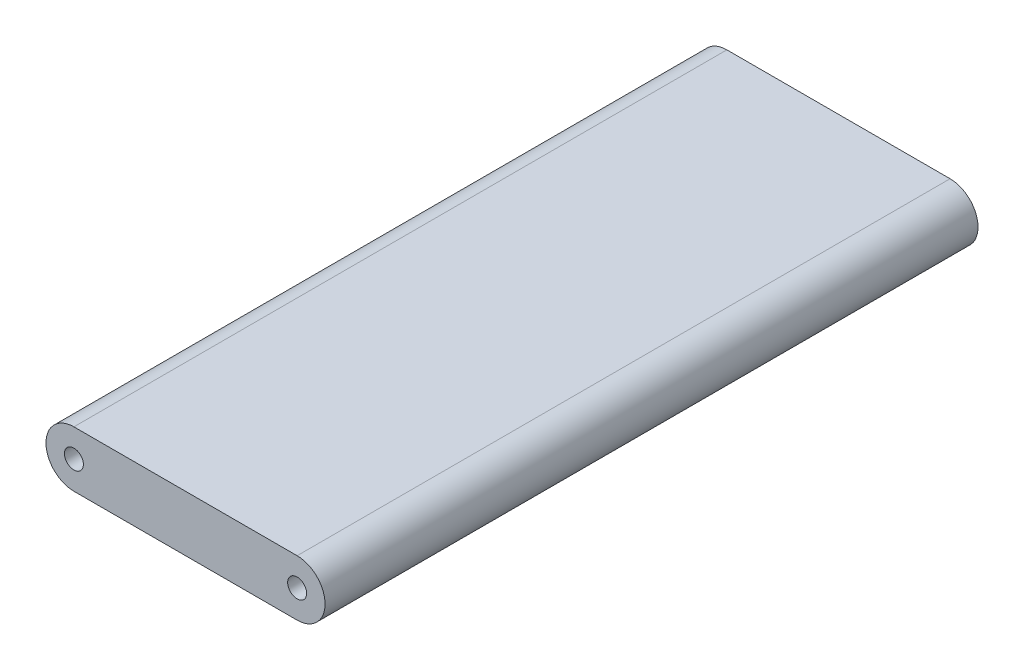
ISO-10303-21;
HEADER;
FILE_DESCRIPTION(('STEP AP214'),'2;1');
FILE_NAME('part.step','',(''),(''),'','','');
FILE_SCHEMA(('AUTOMOTIVE_DESIGN { 1 0 10303 214 1 1 1 1 }'));
ENDSEC;
DATA;
#1=APPLICATION_CONTEXT('core data for automotive mechanical design processes');
#2=APPLICATION_PROTOCOL_DEFINITION('international standard','automotive_design',2000,#1);
#3=PRODUCT_CONTEXT('',#1,'mechanical');
#4=PRODUCT('Part','Part','',(#3));
#5=PRODUCT_RELATED_PRODUCT_CATEGORY('part','',(#4));
#6=PRODUCT_DEFINITION_FORMATION('','',#4);
#7=PRODUCT_DEFINITION_CONTEXT('part definition',#1,'design');
#8=PRODUCT_DEFINITION('design','',#6,#7);
#9=PRODUCT_DEFINITION_SHAPE('','',#8);
#10=(LENGTH_UNIT() NAMED_UNIT(*) SI_UNIT(.MILLI.,.METRE.));
#11=(NAMED_UNIT(*) PLANE_ANGLE_UNIT() SI_UNIT($,.RADIAN.));
#12=(NAMED_UNIT(*) SI_UNIT($,.STERADIAN.) SOLID_ANGLE_UNIT());
#13=UNCERTAINTY_MEASURE_WITH_UNIT(LENGTH_MEASURE(1.E-05),#10,'distance_accuracy_value','');
#14=(GEOMETRIC_REPRESENTATION_CONTEXT(3) GLOBAL_UNCERTAINTY_ASSIGNED_CONTEXT((#13)) GLOBAL_UNIT_ASSIGNED_CONTEXT((#10,
#11,#12)) REPRESENTATION_CONTEXT('',''));
#15=CARTESIAN_POINT('',(0.,0.,0.));
#16=DIRECTION('',(0.,0.,1.));
#17=DIRECTION('',(1.,0.,0.));
#18=AXIS2_PLACEMENT_3D('',#15,#16,#17);
#19=CARTESIAN_POINT('',(0.,0.,58.5));
#20=DIRECTION('',(0.,0.,1.));
#21=DIRECTION('',(1.,0.,0.));
#22=AXIS2_PLACEMENT_3D('',#19,#20,#21);
#23=PLANE('',#22);
#24=CARTESIAN_POINT('',(0.,0.,58.5));
#25=DIRECTION('',(0.,0.,1.));
#26=DIRECTION('',(1.,0.,0.));
#27=AXIS2_PLACEMENT_3D('',#24,#25,#26);
#28=CIRCLE('',#27,0.85);
#29=CARTESIAN_POINT('',(0.85,0.,58.5));
#30=VERTEX_POINT('',#29);
#31=EDGE_CURVE('E100',#30,#30,#28,.T.);
#32=ORIENTED_EDGE('',*,*,#31,.F.);
#33=EDGE_LOOP('',(#32));
#34=FACE_BOUND('',#33,.T.);
#35=CARTESIAN_POINT('',(0.,0.,58.5));
#36=DIRECTION('',(0.,0.,1.));
#37=DIRECTION('',(1.,0.,0.));
#38=AXIS2_PLACEMENT_3D('',#35,#36,#37);
#39=CIRCLE('',#38,2.5);
#40=CARTESIAN_POINT('',(0.,2.5,58.5));
#41=VERTEX_POINT('',#40);
#42=CARTESIAN_POINT('',(0.,-2.5,58.5));
#43=VERTEX_POINT('',#42);
#44=EDGE_CURVE('E85',#41,#43,#39,.T.);
#45=ORIENTED_EDGE('',*,*,#44,.T.);
#46=DIRECTION('',(1.,0.,0.));
#47=VECTOR('',#46,1.);
#48=CARTESIAN_POINT('',(0.,-2.5,58.5));
#49=LINE('',#48,#47);
#50=CARTESIAN_POINT('',(20.,-2.5,58.5));
#51=VERTEX_POINT('',#50);
#52=EDGE_CURVE('E80',#43,#51,#49,.T.);
#53=ORIENTED_EDGE('',*,*,#52,.T.);
#54=CARTESIAN_POINT('',(20.,0.,58.5));
#55=DIRECTION('',(0.,0.,1.));
#56=DIRECTION('',(1.,0.,0.));
#57=AXIS2_PLACEMENT_3D('',#54,#55,#56);
#58=CIRCLE('',#57,2.5);
#59=CARTESIAN_POINT('',(20.,2.5,58.5));
#60=VERTEX_POINT('',#59);
#61=EDGE_CURVE('E83',#51,#60,#58,.T.);
#62=ORIENTED_EDGE('',*,*,#61,.T.);
#63=DIRECTION('',(-1.,0.,0.));
#64=VECTOR('',#63,1.);
#65=CARTESIAN_POINT('',(0.,2.5,58.5));
#66=LINE('',#65,#64);
#67=EDGE_CURVE('E50',#60,#41,#66,.T.);
#68=ORIENTED_EDGE('',*,*,#67,.T.);
#69=EDGE_LOOP('',(#45,#53,#62,#68));
#70=FACE_BOUND('',#69,.T.);
#71=CARTESIAN_POINT('',(20.,0.,58.5));
#72=DIRECTION('',(0.,0.,1.));
#73=DIRECTION('',(1.,0.,0.));
#74=AXIS2_PLACEMENT_3D('',#71,#72,#73);
#75=CIRCLE('',#74,0.85);
#76=CARTESIAN_POINT('',(20.85,0.,58.5));
#77=VERTEX_POINT('',#76);
#78=EDGE_CURVE('E115',#77,#77,#75,.T.);
#79=ORIENTED_EDGE('',*,*,#78,.F.);
#80=EDGE_LOOP('',(#79));
#81=FACE_BOUND('',#80,.T.);
#82=ADVANCED_FACE('F33',(#34,#70,#81),#23,.T.);
#83=CARTESIAN_POINT('',(0.,0.,0.));
#84=DIRECTION('',(0.,0.,1.));
#85=DIRECTION('',(1.,0.,0.));
#86=AXIS2_PLACEMENT_3D('',#83,#84,#85);
#87=PLANE('',#86);
#88=CARTESIAN_POINT('',(0.,0.,0.));
#89=DIRECTION('',(0.,0.,1.));
#90=DIRECTION('',(1.,0.,0.));
#91=AXIS2_PLACEMENT_3D('',#88,#89,#90);
#92=CIRCLE('',#91,2.5);
#93=CARTESIAN_POINT('',(0.,2.5,0.));
#94=VERTEX_POINT('',#93);
#95=CARTESIAN_POINT('',(0.,-2.5,0.));
#96=VERTEX_POINT('',#95);
#97=EDGE_CURVE('E97',#94,#96,#92,.T.);
#98=ORIENTED_EDGE('',*,*,#97,.F.);
#99=DIRECTION('',(-1.,0.,0.));
#100=VECTOR('',#99,1.);
#101=CARTESIAN_POINT('',(0.,2.5,0.));
#102=LINE('',#101,#100);
#103=CARTESIAN_POINT('',(20.,2.5,0.));
#104=VERTEX_POINT('',#103);
#105=EDGE_CURVE('E73',#104,#94,#102,.T.);
#106=ORIENTED_EDGE('',*,*,#105,.F.);
#107=CARTESIAN_POINT('',(20.,0.,0.));
#108=DIRECTION('',(0.,0.,1.));
#109=DIRECTION('',(1.,0.,0.));
#110=AXIS2_PLACEMENT_3D('',#107,#108,#109);
#111=CIRCLE('',#110,2.5);
#112=CARTESIAN_POINT('',(20.,-2.5,0.));
#113=VERTEX_POINT('',#112);
#114=EDGE_CURVE('E67',#113,#104,#111,.T.);
#115=ORIENTED_EDGE('',*,*,#114,.F.);
#116=DIRECTION('',(1.,0.,0.));
#117=VECTOR('',#116,1.);
#118=CARTESIAN_POINT('',(0.,-2.5,0.));
#119=LINE('',#118,#117);
#120=EDGE_CURVE('E89',#96,#113,#119,.T.);
#121=ORIENTED_EDGE('',*,*,#120,.F.);
#122=EDGE_LOOP('',(#98,#106,#115,#121));
#123=FACE_BOUND('',#122,.T.);
#124=CARTESIAN_POINT('',(0.,0.,0.));
#125=DIRECTION('',(0.,0.,1.));
#126=DIRECTION('',(1.,0.,0.));
#127=AXIS2_PLACEMENT_3D('',#124,#125,#126);
#128=CIRCLE('',#127,0.85);
#129=CARTESIAN_POINT('',(0.85,0.,0.));
#130=VERTEX_POINT('',#129);
#131=EDGE_CURVE('E112',#130,#130,#128,.T.);
#132=ORIENTED_EDGE('',*,*,#131,.T.);
#133=EDGE_LOOP('',(#132));
#134=FACE_BOUND('',#133,.T.);
#135=CARTESIAN_POINT('',(20.,0.,0.));
#136=DIRECTION('',(0.,0.,1.));
#137=DIRECTION('',(1.,0.,0.));
#138=AXIS2_PLACEMENT_3D('',#135,#136,#137);
#139=CIRCLE('',#138,0.85);
#140=CARTESIAN_POINT('',(20.85,0.,0.));
#141=VERTEX_POINT('',#140);
#142=EDGE_CURVE('E118',#141,#141,#139,.T.);
#143=ORIENTED_EDGE('',*,*,#142,.T.);
#144=EDGE_LOOP('',(#143));
#145=FACE_BOUND('',#144,.T.);
#146=ADVANCED_FACE('F108',(#123,#134,#145),#87,.F.);
#147=CARTESIAN_POINT('',(0.,0.,58.5));
#148=DIRECTION('',(0.,0.,-1.));
#149=DIRECTION('',(-1.,0.,0.));
#150=AXIS2_PLACEMENT_3D('',#147,#148,#149);
#151=CYLINDRICAL_SURFACE('',#150,2.5);
#152=ORIENTED_EDGE('',*,*,#97,.T.);
#153=DIRECTION('',(0.,0.,-1.));
#154=VECTOR('',#153,1.);
#155=CARTESIAN_POINT('',(0.,-2.5,58.5));
#156=LINE('',#155,#154);
#157=EDGE_CURVE('E11',#43,#96,#156,.T.);
#158=ORIENTED_EDGE('',*,*,#157,.F.);
#159=ORIENTED_EDGE('',*,*,#44,.F.);
#160=DIRECTION('',(0.,0.,-1.));
#161=VECTOR('',#160,1.);
#162=CARTESIAN_POINT('',(0.,2.5,58.5));
#163=LINE('',#162,#161);
#164=EDGE_CURVE('E93',#41,#94,#163,.T.);
#165=ORIENTED_EDGE('',*,*,#164,.T.);
#166=EDGE_LOOP('',(#152,#158,#159,#165));
#167=FACE_BOUND('',#166,.T.);
#168=ADVANCED_FACE('F35',(#167),#151,.T.);
#169=CARTESIAN_POINT('',(0.,-2.5,58.5));
#170=DIRECTION('',(0.,1.,0.));
#171=DIRECTION('',(-1.,0.,0.));
#172=AXIS2_PLACEMENT_3D('',#169,#170,#171);
#173=PLANE('',#172);
#174=ORIENTED_EDGE('',*,*,#120,.T.);
#175=DIRECTION('',(0.,0.,-1.));
#176=VECTOR('',#175,1.);
#177=CARTESIAN_POINT('',(20.,-2.5,58.5));
#178=LINE('',#177,#176);
#179=EDGE_CURVE('E42',#51,#113,#178,.T.);
#180=ORIENTED_EDGE('',*,*,#179,.F.);
#181=ORIENTED_EDGE('',*,*,#52,.F.);
#182=ORIENTED_EDGE('',*,*,#157,.T.);
#183=EDGE_LOOP('',(#174,#180,#181,#182));
#184=FACE_BOUND('',#183,.T.);
#185=ADVANCED_FACE('F88',(#184),#173,.F.);
#186=CARTESIAN_POINT('',(20.,0.,58.5));
#187=DIRECTION('',(0.,0.,-1.));
#188=DIRECTION('',(-1.,0.,0.));
#189=AXIS2_PLACEMENT_3D('',#186,#187,#188);
#190=CYLINDRICAL_SURFACE('',#189,2.5);
#191=ORIENTED_EDGE('',*,*,#114,.T.);
#192=DIRECTION('',(0.,0.,-1.));
#193=VECTOR('',#192,1.);
#194=CARTESIAN_POINT('',(20.,2.5,58.5));
#195=LINE('',#194,#193);
#196=EDGE_CURVE('E90',#60,#104,#195,.T.);
#197=ORIENTED_EDGE('',*,*,#196,.F.);
#198=ORIENTED_EDGE('',*,*,#61,.F.);
#199=ORIENTED_EDGE('',*,*,#179,.T.);
#200=EDGE_LOOP('',(#191,#197,#198,#199));
#201=FACE_BOUND('',#200,.T.);
#202=ADVANCED_FACE('F91',(#201),#190,.T.);
#203=CARTESIAN_POINT('',(0.,2.5,58.5));
#204=DIRECTION('',(0.,-1.,0.));
#205=DIRECTION('',(0.,0.,-1.));
#206=AXIS2_PLACEMENT_3D('',#203,#204,#205);
#207=PLANE('',#206);
#208=ORIENTED_EDGE('',*,*,#105,.T.);
#209=ORIENTED_EDGE('',*,*,#164,.F.);
#210=ORIENTED_EDGE('',*,*,#67,.F.);
#211=ORIENTED_EDGE('',*,*,#196,.T.);
#212=EDGE_LOOP('',(#208,#209,#210,#211));
#213=FACE_BOUND('',#212,.T.);
#214=ADVANCED_FACE('F105',(#213),#207,.F.);
#215=CARTESIAN_POINT('',(0.,0.,58.5));
#216=DIRECTION('',(0.,0.,-1.));
#217=DIRECTION('',(-1.,0.,0.));
#218=AXIS2_PLACEMENT_3D('',#215,#216,#217);
#219=CYLINDRICAL_SURFACE('',#218,0.85);
#220=ORIENTED_EDGE('',*,*,#31,.T.);
#221=EDGE_LOOP('',(#220));
#222=FACE_BOUND('',#221,.T.);
#223=ORIENTED_EDGE('',*,*,#131,.F.);
#224=EDGE_LOOP('',(#223));
#225=FACE_BOUND('',#224,.T.);
#226=ADVANCED_FACE('F135',(#222,#225),#219,.F.);
#227=CARTESIAN_POINT('',(20.,0.,58.5));
#228=DIRECTION('',(0.,0.,-1.));
#229=DIRECTION('',(-1.,0.,0.));
#230=AXIS2_PLACEMENT_3D('',#227,#228,#229);
#231=CYLINDRICAL_SURFACE('',#230,0.85);
#232=ORIENTED_EDGE('',*,*,#78,.T.);
#233=EDGE_LOOP('',(#232));
#234=FACE_BOUND('',#233,.T.);
#235=ORIENTED_EDGE('',*,*,#142,.F.);
#236=EDGE_LOOP('',(#235));
#237=FACE_BOUND('',#236,.T.);
#238=ADVANCED_FACE('F124',(#234,#237),#231,.F.);
#239=CLOSED_SHELL('',(#82,#146,#168,#185,#202,#214,#226,#238));
#240=MANIFOLD_SOLID_BREP('B2',#239);
#241=ADVANCED_BREP_SHAPE_REPRESENTATION('',(#18,#240),#14);
#242=SHAPE_DEFINITION_REPRESENTATION(#9,#241);
ENDSEC;
END-ISO-10303-21;
